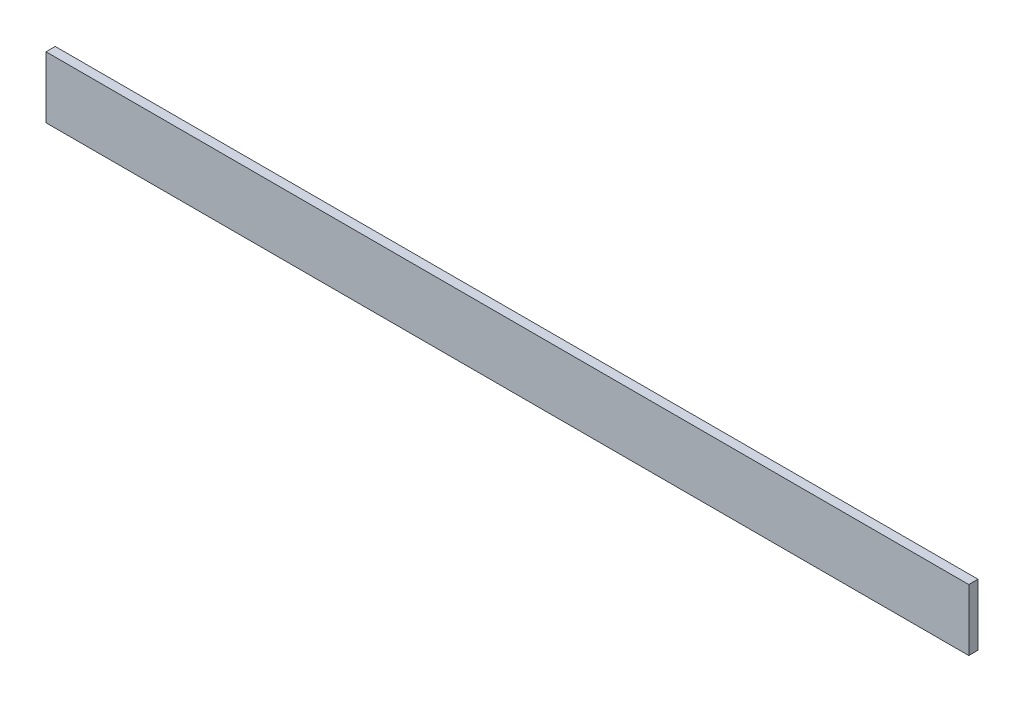
ISO-10303-21;
HEADER;
FILE_DESCRIPTION(('STEP AP214'),'2;1');
FILE_NAME('part.step','',(''),(''),'','','');
FILE_SCHEMA(('AUTOMOTIVE_DESIGN { 1 0 10303 214 1 1 1 1 }'));
ENDSEC;
DATA;
#1=APPLICATION_CONTEXT('core data for automotive mechanical design processes');
#2=APPLICATION_PROTOCOL_DEFINITION('international standard','automotive_design',2000,#1);
#3=PRODUCT_CONTEXT('',#1,'mechanical');
#4=PRODUCT('Part','Part','',(#3));
#5=PRODUCT_RELATED_PRODUCT_CATEGORY('part','',(#4));
#6=PRODUCT_DEFINITION_FORMATION('','',#4);
#7=PRODUCT_DEFINITION_CONTEXT('part definition',#1,'design');
#8=PRODUCT_DEFINITION('design','',#6,#7);
#9=PRODUCT_DEFINITION_SHAPE('','',#8);
#10=(LENGTH_UNIT() NAMED_UNIT(*) SI_UNIT(.MILLI.,.METRE.));
#11=(NAMED_UNIT(*) PLANE_ANGLE_UNIT() SI_UNIT($,.RADIAN.));
#12=(NAMED_UNIT(*) SI_UNIT($,.STERADIAN.) SOLID_ANGLE_UNIT());
#13=UNCERTAINTY_MEASURE_WITH_UNIT(LENGTH_MEASURE(1.E-05),#10,'distance_accuracy_value','');
#14=(GEOMETRIC_REPRESENTATION_CONTEXT(3) GLOBAL_UNCERTAINTY_ASSIGNED_CONTEXT((#13)) GLOBAL_UNIT_ASSIGNED_CONTEXT((#10,
#11,#12)) REPRESENTATION_CONTEXT('',''));
#15=CARTESIAN_POINT('',(0.,0.,0.));
#16=DIRECTION('',(0.,0.,1.));
#17=DIRECTION('',(1.,0.,0.));
#18=AXIS2_PLACEMENT_3D('',#15,#16,#17);
#19=CARTESIAN_POINT('',(150.,-10.,3.));
#20=DIRECTION('',(-1.,0.,0.));
#21=DIRECTION('',(0.,0.,1.));
#22=AXIS2_PLACEMENT_3D('',#19,#20,#21);
#23=PLANE('',#22);
#24=DIRECTION('',(0.,1.,0.));
#25=VECTOR('',#24,1.);
#26=CARTESIAN_POINT('',(150.,-10.,0.));
#27=LINE('',#26,#25);
#28=CARTESIAN_POINT('',(150.,-10.,0.));
#29=VERTEX_POINT('',#28);
#30=CARTESIAN_POINT('',(150.,10.,0.));
#31=VERTEX_POINT('',#30);
#32=EDGE_CURVE('E102',#29,#31,#27,.T.);
#33=ORIENTED_EDGE('',*,*,#32,.T.);
#34=DIRECTION('',(0.,0.,-1.));
#35=VECTOR('',#34,1.);
#36=CARTESIAN_POINT('',(150.,10.,3.));
#37=LINE('',#36,#35);
#38=CARTESIAN_POINT('',(150.,10.,3.));
#39=VERTEX_POINT('',#38);
#40=EDGE_CURVE('E11',#39,#31,#37,.T.);
#41=ORIENTED_EDGE('',*,*,#40,.F.);
#42=DIRECTION('',(0.,1.,0.));
#43=VECTOR('',#42,1.);
#44=CARTESIAN_POINT('',(150.,-10.,3.));
#45=LINE('',#44,#43);
#46=CARTESIAN_POINT('',(150.,-10.,3.));
#47=VERTEX_POINT('',#46);
#48=EDGE_CURVE('E90',#47,#39,#45,.T.);
#49=ORIENTED_EDGE('',*,*,#48,.F.);
#50=DIRECTION('',(0.,0.,-1.));
#51=VECTOR('',#50,1.);
#52=CARTESIAN_POINT('',(150.,-10.,3.));
#53=LINE('',#52,#51);
#54=EDGE_CURVE('E98',#47,#29,#53,.T.);
#55=ORIENTED_EDGE('',*,*,#54,.T.);
#56=EDGE_LOOP('',(#33,#41,#49,#55));
#57=FACE_BOUND('',#56,.T.);
#58=ADVANCED_FACE('F39',(#57),#23,.F.);
#59=CARTESIAN_POINT('',(-150.,10.,3.));
#60=DIRECTION('',(0.,-1.,0.));
#61=DIRECTION('',(0.,0.,-1.));
#62=AXIS2_PLACEMENT_3D('',#59,#60,#61);
#63=PLANE('',#62);
#64=DIRECTION('',(-1.,0.,0.));
#65=VECTOR('',#64,1.);
#66=CARTESIAN_POINT('',(-150.,10.,0.));
#67=LINE('',#66,#65);
#68=CARTESIAN_POINT('',(-150.,10.,0.));
#69=VERTEX_POINT('',#68);
#70=EDGE_CURVE('E94',#31,#69,#67,.T.);
#71=ORIENTED_EDGE('',*,*,#70,.T.);
#72=DIRECTION('',(0.,0.,-1.));
#73=VECTOR('',#72,1.);
#74=CARTESIAN_POINT('',(-150.,10.,3.));
#75=LINE('',#74,#73);
#76=CARTESIAN_POINT('',(-150.,10.,3.));
#77=VERTEX_POINT('',#76);
#78=EDGE_CURVE('E47',#77,#69,#75,.T.);
#79=ORIENTED_EDGE('',*,*,#78,.F.);
#80=DIRECTION('',(-1.,0.,0.));
#81=VECTOR('',#80,1.);
#82=CARTESIAN_POINT('',(-150.,10.,3.));
#83=LINE('',#82,#81);
#84=EDGE_CURVE('E85',#39,#77,#83,.T.);
#85=ORIENTED_EDGE('',*,*,#84,.F.);
#86=ORIENTED_EDGE('',*,*,#40,.T.);
#87=EDGE_LOOP('',(#71,#79,#85,#86));
#88=FACE_BOUND('',#87,.T.);
#89=ADVANCED_FACE('F93',(#88),#63,.F.);
#90=CARTESIAN_POINT('',(-150.,-10.,3.));
#91=DIRECTION('',(1.,0.,0.));
#92=DIRECTION('',(0.,0.,-1.));
#93=AXIS2_PLACEMENT_3D('',#90,#91,#92);
#94=PLANE('',#93);
#95=DIRECTION('',(0.,-1.,0.));
#96=VECTOR('',#95,1.);
#97=CARTESIAN_POINT('',(-150.,-10.,0.));
#98=LINE('',#97,#96);
#99=CARTESIAN_POINT('',(-150.,-10.,0.));
#100=VERTEX_POINT('',#99);
#101=EDGE_CURVE('E72',#69,#100,#98,.T.);
#102=ORIENTED_EDGE('',*,*,#101,.T.);
#103=DIRECTION('',(0.,0.,-1.));
#104=VECTOR('',#103,1.);
#105=CARTESIAN_POINT('',(-150.,-10.,3.));
#106=LINE('',#105,#104);
#107=CARTESIAN_POINT('',(-150.,-10.,3.));
#108=VERTEX_POINT('',#107);
#109=EDGE_CURVE('E95',#108,#100,#106,.T.);
#110=ORIENTED_EDGE('',*,*,#109,.F.);
#111=DIRECTION('',(0.,-1.,0.));
#112=VECTOR('',#111,1.);
#113=CARTESIAN_POINT('',(-150.,-10.,3.));
#114=LINE('',#113,#112);
#115=EDGE_CURVE('E88',#77,#108,#114,.T.);
#116=ORIENTED_EDGE('',*,*,#115,.F.);
#117=ORIENTED_EDGE('',*,*,#78,.T.);
#118=EDGE_LOOP('',(#102,#110,#116,#117));
#119=FACE_BOUND('',#118,.T.);
#120=ADVANCED_FACE('F96',(#119),#94,.F.);
#121=CARTESIAN_POINT('',(-150.,-10.,3.));
#122=DIRECTION('',(0.,1.,0.));
#123=DIRECTION('',(0.,0.,1.));
#124=AXIS2_PLACEMENT_3D('',#121,#122,#123);
#125=PLANE('',#124);
#126=DIRECTION('',(1.,0.,0.));
#127=VECTOR('',#126,1.);
#128=CARTESIAN_POINT('',(-150.,-10.,0.));
#129=LINE('',#128,#127);
#130=EDGE_CURVE('E78',#100,#29,#129,.T.);
#131=ORIENTED_EDGE('',*,*,#130,.T.);
#132=ORIENTED_EDGE('',*,*,#54,.F.);
#133=DIRECTION('',(1.,0.,0.));
#134=VECTOR('',#133,1.);
#135=CARTESIAN_POINT('',(-150.,-10.,3.));
#136=LINE('',#135,#134);
#137=EDGE_CURVE('E55',#108,#47,#136,.T.);
#138=ORIENTED_EDGE('',*,*,#137,.F.);
#139=ORIENTED_EDGE('',*,*,#109,.T.);
#140=EDGE_LOOP('',(#131,#132,#138,#139));
#141=FACE_BOUND('',#140,.T.);
#142=ADVANCED_FACE('F109',(#141),#125,.F.);
#143=CARTESIAN_POINT('',(0.,0.,3.));
#144=DIRECTION('',(0.,0.,-1.));
#145=DIRECTION('',(-1.,0.,0.));
#146=AXIS2_PLACEMENT_3D('',#143,#144,#145);
#147=PLANE('',#146);
#148=ORIENTED_EDGE('',*,*,#48,.T.);
#149=ORIENTED_EDGE('',*,*,#84,.T.);
#150=ORIENTED_EDGE('',*,*,#115,.T.);
#151=ORIENTED_EDGE('',*,*,#137,.T.);
#152=EDGE_LOOP('',(#148,#149,#150,#151));
#153=FACE_BOUND('',#152,.T.);
#154=ADVANCED_FACE('F86',(#153),#147,.F.);
#155=CARTESIAN_POINT('',(0.,0.,0.));
#156=DIRECTION('',(0.,0.,-1.));
#157=DIRECTION('',(-1.,0.,0.));
#158=AXIS2_PLACEMENT_3D('',#155,#156,#157);
#159=PLANE('',#158);
#160=ORIENTED_EDGE('',*,*,#32,.F.);
#161=ORIENTED_EDGE('',*,*,#130,.F.);
#162=ORIENTED_EDGE('',*,*,#101,.F.);
#163=ORIENTED_EDGE('',*,*,#70,.F.);
#164=EDGE_LOOP('',(#160,#161,#162,#163));
#165=FACE_BOUND('',#164,.T.);
#166=ADVANCED_FACE('F112',(#165),#159,.T.);
#167=CLOSED_SHELL('',(#58,#89,#120,#142,#154,#166));
#168=MANIFOLD_SOLID_BREP('B2',#167);
#169=ADVANCED_BREP_SHAPE_REPRESENTATION('',(#18,#168),#14);
#170=SHAPE_DEFINITION_REPRESENTATION(#9,#169);
ENDSEC;
END-ISO-10303-21;
